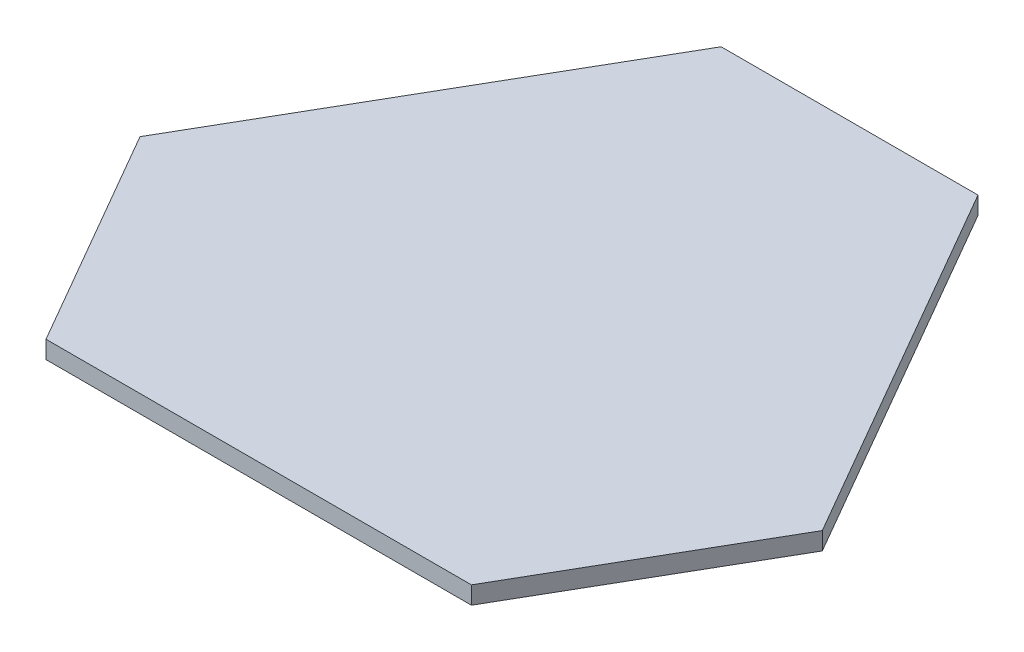
ISO-10303-21;
HEADER;
FILE_DESCRIPTION(('STEP AP214'),'2;1');
FILE_NAME('part.step','',(''),(''),'','','');
FILE_SCHEMA(('AUTOMOTIVE_DESIGN { 1 0 10303 214 1 1 1 1 }'));
ENDSEC;
DATA;
#1=APPLICATION_CONTEXT('core data for automotive mechanical design processes');
#2=APPLICATION_PROTOCOL_DEFINITION('international standard','automotive_design',2000,#1);
#3=PRODUCT_CONTEXT('',#1,'mechanical');
#4=PRODUCT('Part','Part','',(#3));
#5=PRODUCT_RELATED_PRODUCT_CATEGORY('part','',(#4));
#6=PRODUCT_DEFINITION_FORMATION('','',#4);
#7=PRODUCT_DEFINITION_CONTEXT('part definition',#1,'design');
#8=PRODUCT_DEFINITION('design','',#6,#7);
#9=PRODUCT_DEFINITION_SHAPE('','',#8);
#10=(LENGTH_UNIT() NAMED_UNIT(*) SI_UNIT(.MILLI.,.METRE.));
#11=(NAMED_UNIT(*) PLANE_ANGLE_UNIT() SI_UNIT($,.RADIAN.));
#12=(NAMED_UNIT(*) SI_UNIT($,.STERADIAN.) SOLID_ANGLE_UNIT());
#13=UNCERTAINTY_MEASURE_WITH_UNIT(LENGTH_MEASURE(1.E-05),#10,'distance_accuracy_value','');
#14=(GEOMETRIC_REPRESENTATION_CONTEXT(3) GLOBAL_UNCERTAINTY_ASSIGNED_CONTEXT((#13)) GLOBAL_UNIT_ASSIGNED_CONTEXT((#10,
#11,#12)) REPRESENTATION_CONTEXT('',''));
#15=CARTESIAN_POINT('',(0.,0.,0.));
#16=DIRECTION('',(0.,0.,1.));
#17=DIRECTION('',(1.,0.,0.));
#18=AXIS2_PLACEMENT_3D('',#15,#16,#17);
#19=CARTESIAN_POINT('',(-212.5,11.,45.4359353944872));
#20=DIRECTION('',(0.866025403784438,0.,0.500000000000002));
#21=DIRECTION('',(0.500000000000002,0.,-0.866025403784437));
#22=AXIS2_PLACEMENT_3D('',#19,#20,#21);
#23=PLANE('',#22);
#24=DIRECTION('',(-0.500000000000002,0.,0.866025403784438));
#25=VECTOR('',#24,1.);
#26=CARTESIAN_POINT('',(-212.5,0.,45.4359353944872));
#27=LINE('',#26,#25);
#28=CARTESIAN_POINT('',(-79.9999999999991,0.,-184.060796608389));
#29=VERTEX_POINT('',#28);
#30=CARTESIAN_POINT('',(-212.5,0.,45.4359353944872));
#31=VERTEX_POINT('',#30);
#32=EDGE_CURVE('E126',#29,#31,#27,.T.);
#33=ORIENTED_EDGE('',*,*,#32,.T.);
#34=DIRECTION('',(0.,-1.,0.));
#35=VECTOR('',#34,1.);
#36=CARTESIAN_POINT('',(-212.5,11.,45.4359353944872));
#37=LINE('',#36,#35);
#38=CARTESIAN_POINT('',(-212.5,11.,45.4359353944872));
#39=VERTEX_POINT('',#38);
#40=EDGE_CURVE('E11',#39,#31,#37,.T.);
#41=ORIENTED_EDGE('',*,*,#40,.F.);
#42=DIRECTION('',(-0.500000000000002,0.,0.866025403784438));
#43=VECTOR('',#42,1.);
#44=CARTESIAN_POINT('',(-212.5,11.,45.4359353944872));
#45=LINE('',#44,#43);
#46=CARTESIAN_POINT('',(-79.9999999999991,11.,-184.060796608389));
#47=VERTEX_POINT('',#46);
#48=EDGE_CURVE('E136',#47,#39,#45,.T.);
#49=ORIENTED_EDGE('',*,*,#48,.F.);
#50=DIRECTION('',(0.,-1.,0.));
#51=VECTOR('',#50,1.);
#52=CARTESIAN_POINT('',(-79.9999999999991,11.,-184.060796608389));
#53=LINE('',#52,#51);
#54=EDGE_CURVE('E122',#47,#29,#53,.T.);
#55=ORIENTED_EDGE('',*,*,#54,.T.);
#56=EDGE_LOOP('',(#33,#41,#49,#55));
#57=FACE_BOUND('',#56,.T.);
#58=ADVANCED_FACE('F42',(#57),#23,.F.);
#59=CARTESIAN_POINT('',(-132.500000000008,11.,183.999999999999));
#60=DIRECTION('',(0.866025403784461,0.,-0.499999999999961));
#61=DIRECTION('',(-0.499999999999961,0.,-0.866025403784461));
#62=AXIS2_PLACEMENT_3D('',#59,#60,#61);
#63=PLANE('',#62);
#64=DIRECTION('',(0.499999999999961,0.,0.866025403784461));
#65=VECTOR('',#64,1.);
#66=CARTESIAN_POINT('',(-132.500000000008,0.,183.999999999999));
#67=LINE('',#66,#65);
#68=CARTESIAN_POINT('',(-132.500000000008,0.,183.999999999999));
#69=VERTEX_POINT('',#68);
#70=EDGE_CURVE('E129',#31,#69,#67,.T.);
#71=ORIENTED_EDGE('',*,*,#70,.T.);
#72=DIRECTION('',(0.,-1.,0.));
#73=VECTOR('',#72,1.);
#74=CARTESIAN_POINT('',(-132.500000000008,11.,183.999999999999));
#75=LINE('',#74,#73);
#76=CARTESIAN_POINT('',(-132.500000000008,11.,183.999999999999));
#77=VERTEX_POINT('',#76);
#78=EDGE_CURVE('E50',#77,#69,#75,.T.);
#79=ORIENTED_EDGE('',*,*,#78,.F.);
#80=DIRECTION('',(0.499999999999961,0.,0.866025403784461));
#81=VECTOR('',#80,1.);
#82=CARTESIAN_POINT('',(-132.500000000008,11.,183.999999999999));
#83=LINE('',#82,#81);
#84=EDGE_CURVE('E95',#39,#77,#83,.T.);
#85=ORIENTED_EDGE('',*,*,#84,.F.);
#86=ORIENTED_EDGE('',*,*,#40,.T.);
#87=EDGE_LOOP('',(#71,#79,#85,#86));
#88=FACE_BOUND('',#87,.T.);
#89=ADVANCED_FACE('F160',(#88),#63,.F.);
#90=CARTESIAN_POINT('',(132.499999999992,11.,183.999999999999));
#91=DIRECTION('',(0.,0.,-1.));
#92=DIRECTION('',(-1.,0.,0.));
#93=AXIS2_PLACEMENT_3D('',#90,#91,#92);
#94=PLANE('',#93);
#95=DIRECTION('',(1.,0.,0.));
#96=VECTOR('',#95,1.);
#97=CARTESIAN_POINT('',(132.499999999992,0.,183.999999999999));
#98=LINE('',#97,#96);
#99=CARTESIAN_POINT('',(132.499999999992,0.,183.999999999999));
#100=VERTEX_POINT('',#99);
#101=EDGE_CURVE('E131',#69,#100,#98,.T.);
#102=ORIENTED_EDGE('',*,*,#101,.T.);
#103=DIRECTION('',(0.,-1.,0.));
#104=VECTOR('',#103,1.);
#105=CARTESIAN_POINT('',(132.499999999992,11.,183.999999999999));
#106=LINE('',#105,#104);
#107=CARTESIAN_POINT('',(132.499999999992,11.,183.999999999999));
#108=VERTEX_POINT('',#107);
#109=EDGE_CURVE('E117',#108,#100,#106,.T.);
#110=ORIENTED_EDGE('',*,*,#109,.F.);
#111=DIRECTION('',(1.,0.,0.));
#112=VECTOR('',#111,1.);
#113=CARTESIAN_POINT('',(132.499999999992,11.,183.999999999999));
#114=LINE('',#113,#112);
#115=EDGE_CURVE('E108',#77,#108,#114,.T.);
#116=ORIENTED_EDGE('',*,*,#115,.F.);
#117=ORIENTED_EDGE('',*,*,#78,.T.);
#118=EDGE_LOOP('',(#102,#110,#116,#117));
#119=FACE_BOUND('',#118,.T.);
#120=ADVANCED_FACE('F142',(#119),#94,.F.);
#121=CARTESIAN_POINT('',(212.499999999996,11.,45.4359353944879));
#122=DIRECTION('',(-0.866025403784431,0.,-0.500000000000014));
#123=DIRECTION('',(-0.500000000000014,0.,0.866025403784431));
#124=AXIS2_PLACEMENT_3D('',#121,#122,#123);
#125=PLANE('',#124);
#126=DIRECTION('',(0.500000000000013,0.,-0.866025403784431));
#127=VECTOR('',#126,1.);
#128=CARTESIAN_POINT('',(212.499999999996,0.,45.4359353944879));
#129=LINE('',#128,#127);
#130=CARTESIAN_POINT('',(212.499999999996,0.,45.4359353944879));
#131=VERTEX_POINT('',#130);
#132=EDGE_CURVE('E116',#100,#131,#129,.T.);
#133=ORIENTED_EDGE('',*,*,#132,.T.);
#134=DIRECTION('',(0.,-1.,0.));
#135=VECTOR('',#134,1.);
#136=CARTESIAN_POINT('',(212.499999999996,11.,45.4359353944879));
#137=LINE('',#136,#135);
#138=CARTESIAN_POINT('',(212.499999999996,11.,45.4359353944879));
#139=VERTEX_POINT('',#138);
#140=EDGE_CURVE('E113',#139,#131,#137,.T.);
#141=ORIENTED_EDGE('',*,*,#140,.F.);
#142=DIRECTION('',(0.500000000000013,0.,-0.866025403784431));
#143=VECTOR('',#142,1.);
#144=CARTESIAN_POINT('',(212.499999999996,11.,45.4359353944879));
#145=LINE('',#144,#143);
#146=EDGE_CURVE('E102',#108,#139,#145,.T.);
#147=ORIENTED_EDGE('',*,*,#146,.F.);
#148=ORIENTED_EDGE('',*,*,#109,.T.);
#149=EDGE_LOOP('',(#133,#141,#147,#148));
#150=FACE_BOUND('',#149,.T.);
#151=ADVANCED_FACE('F114',(#150),#125,.F.);
#152=CARTESIAN_POINT('',(79.9999999999978,11.,-184.06079660839));
#153=DIRECTION('',(-0.866025403784444,0.,0.499999999999992));
#154=DIRECTION('',(0.499999999999992,0.,0.866025403784443));
#155=AXIS2_PLACEMENT_3D('',#152,#153,#154);
#156=PLANE('',#155);
#157=DIRECTION('',(-0.499999999999992,0.,-0.866025403784443));
#158=VECTOR('',#157,1.);
#159=CARTESIAN_POINT('',(79.9999999999978,0.,-184.06079660839));
#160=LINE('',#159,#158);
#161=CARTESIAN_POINT('',(79.9999999999978,0.,-184.06079660839));
#162=VERTEX_POINT('',#161);
#163=EDGE_CURVE('E81',#131,#162,#160,.T.);
#164=ORIENTED_EDGE('',*,*,#163,.T.);
#165=DIRECTION('',(0.,-1.,0.));
#166=VECTOR('',#165,1.);
#167=CARTESIAN_POINT('',(79.9999999999978,11.,-184.06079660839));
#168=LINE('',#167,#166);
#169=CARTESIAN_POINT('',(79.9999999999978,11.,-184.06079660839));
#170=VERTEX_POINT('',#169);
#171=EDGE_CURVE('E118',#170,#162,#168,.T.);
#172=ORIENTED_EDGE('',*,*,#171,.F.);
#173=DIRECTION('',(-0.499999999999992,0.,-0.866025403784443));
#174=VECTOR('',#173,1.);
#175=CARTESIAN_POINT('',(79.9999999999978,11.,-184.06079660839));
#176=LINE('',#175,#174);
#177=EDGE_CURVE('E106',#139,#170,#176,.T.);
#178=ORIENTED_EDGE('',*,*,#177,.F.);
#179=ORIENTED_EDGE('',*,*,#140,.T.);
#180=EDGE_LOOP('',(#164,#172,#178,#179));
#181=FACE_BOUND('',#180,.T.);
#182=ADVANCED_FACE('F120',(#181),#156,.F.);
#183=CARTESIAN_POINT('',(-79.9999999999991,11.,-184.060796608389));
#184=DIRECTION('',(0.,0.,1.));
#185=DIRECTION('',(1.,0.,0.));
#186=AXIS2_PLACEMENT_3D('',#183,#184,#185);
#187=PLANE('',#186);
#188=DIRECTION('',(-1.,0.,0.));
#189=VECTOR('',#188,1.);
#190=CARTESIAN_POINT('',(-79.9999999999991,0.,-184.060796608389));
#191=LINE('',#190,#189);
#192=EDGE_CURVE('E87',#162,#29,#191,.T.);
#193=ORIENTED_EDGE('',*,*,#192,.T.);
#194=ORIENTED_EDGE('',*,*,#54,.F.);
#195=DIRECTION('',(-1.,0.,0.));
#196=VECTOR('',#195,1.);
#197=CARTESIAN_POINT('',(-79.9999999999991,11.,-184.060796608389));
#198=LINE('',#197,#196);
#199=EDGE_CURVE('E58',#170,#47,#198,.T.);
#200=ORIENTED_EDGE('',*,*,#199,.F.);
#201=ORIENTED_EDGE('',*,*,#171,.T.);
#202=EDGE_LOOP('',(#193,#194,#200,#201));
#203=FACE_BOUND('',#202,.T.);
#204=ADVANCED_FACE('F149',(#203),#187,.F.);
#205=CARTESIAN_POINT('',(0.,11.,0.));
#206=DIRECTION('',(0.,-1.,0.));
#207=DIRECTION('',(0.,0.,-1.));
#208=AXIS2_PLACEMENT_3D('',#205,#206,#207);
#209=PLANE('',#208);
#210=ORIENTED_EDGE('',*,*,#48,.T.);
#211=ORIENTED_EDGE('',*,*,#84,.T.);
#212=ORIENTED_EDGE('',*,*,#115,.T.);
#213=ORIENTED_EDGE('',*,*,#146,.T.);
#214=ORIENTED_EDGE('',*,*,#177,.T.);
#215=ORIENTED_EDGE('',*,*,#199,.T.);
#216=EDGE_LOOP('',(#210,#211,#212,#213,#214,#215));
#217=FACE_BOUND('',#216,.T.);
#218=ADVANCED_FACE('F104',(#217),#209,.F.);
#219=CARTESIAN_POINT('',(0.,0.,0.));
#220=DIRECTION('',(0.,-1.,0.));
#221=DIRECTION('',(0.,0.,-1.));
#222=AXIS2_PLACEMENT_3D('',#219,#220,#221);
#223=PLANE('',#222);
#224=ORIENTED_EDGE('',*,*,#32,.F.);
#225=ORIENTED_EDGE('',*,*,#192,.F.);
#226=ORIENTED_EDGE('',*,*,#163,.F.);
#227=ORIENTED_EDGE('',*,*,#132,.F.);
#228=ORIENTED_EDGE('',*,*,#101,.F.);
#229=ORIENTED_EDGE('',*,*,#70,.F.);
#230=EDGE_LOOP('',(#224,#225,#226,#227,#228,#229));
#231=FACE_BOUND('',#230,.T.);
#232=ADVANCED_FACE('F145',(#231),#223,.T.);
#233=CLOSED_SHELL('',(#58,#89,#120,#151,#182,#204,#218,#232));
#234=MANIFOLD_SOLID_BREP('B2',#233);
#235=ADVANCED_BREP_SHAPE_REPRESENTATION('',(#18,#234),#14);
#236=SHAPE_DEFINITION_REPRESENTATION(#9,#235);
ENDSEC;
END-ISO-10303-21;
